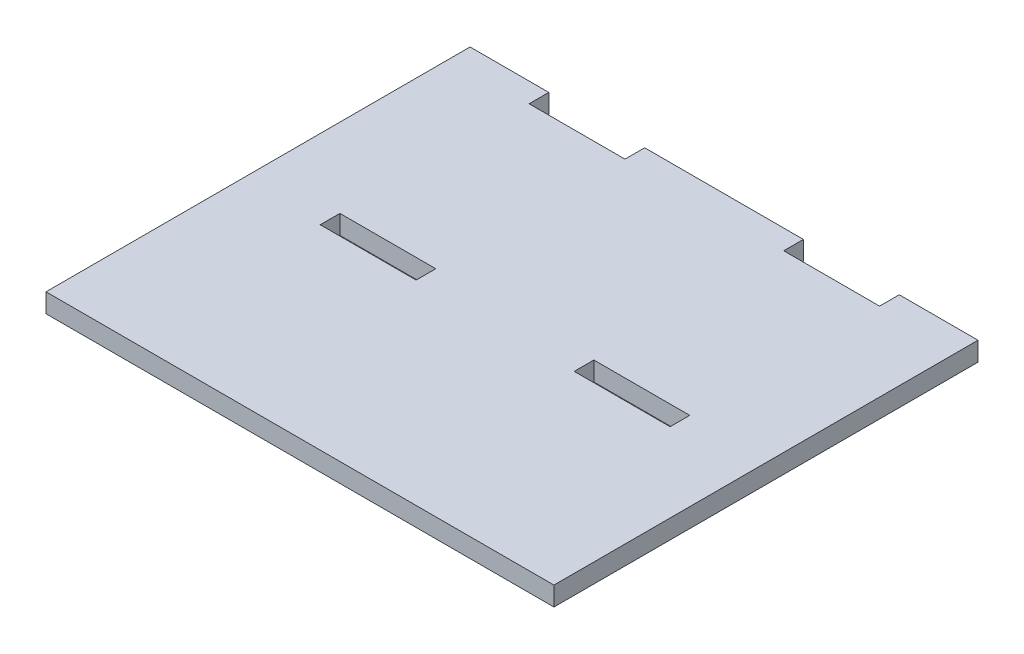
ISO-10303-21;
HEADER;
FILE_DESCRIPTION(('STEP AP214'),'2;1');
FILE_NAME('part.step','',(''),(''),'','','');
FILE_SCHEMA(('AUTOMOTIVE_DESIGN { 1 0 10303 214 1 1 1 1 }'));
ENDSEC;
DATA;
#1=APPLICATION_CONTEXT('core data for automotive mechanical design processes');
#2=APPLICATION_PROTOCOL_DEFINITION('international standard','automotive_design',2000,#1);
#3=PRODUCT_CONTEXT('',#1,'mechanical');
#4=PRODUCT('Part','Part','',(#3));
#5=PRODUCT_RELATED_PRODUCT_CATEGORY('part','',(#4));
#6=PRODUCT_DEFINITION_FORMATION('','',#4);
#7=PRODUCT_DEFINITION_CONTEXT('part definition',#1,'design');
#8=PRODUCT_DEFINITION('design','',#6,#7);
#9=PRODUCT_DEFINITION_SHAPE('','',#8);
#10=(LENGTH_UNIT() NAMED_UNIT(*) SI_UNIT(.MILLI.,.METRE.));
#11=(NAMED_UNIT(*) PLANE_ANGLE_UNIT() SI_UNIT($,.RADIAN.));
#12=(NAMED_UNIT(*) SI_UNIT($,.STERADIAN.) SOLID_ANGLE_UNIT());
#13=UNCERTAINTY_MEASURE_WITH_UNIT(LENGTH_MEASURE(1.E-05),#10,'distance_accuracy_value','');
#14=(GEOMETRIC_REPRESENTATION_CONTEXT(3) GLOBAL_UNCERTAINTY_ASSIGNED_CONTEXT((#13)) GLOBAL_UNIT_ASSIGNED_CONTEXT((#10,
#11,#12)) REPRESENTATION_CONTEXT('',''));
#15=CARTESIAN_POINT('',(0.,0.,0.));
#16=DIRECTION('',(0.,0.,1.));
#17=DIRECTION('',(1.,0.,0.));
#18=AXIS2_PLACEMENT_3D('',#15,#16,#17);
#19=CARTESIAN_POINT('',(0.,3.,0.));
#20=DIRECTION('',(0.,-1.,0.));
#21=DIRECTION('',(0.,0.,-1.));
#22=AXIS2_PLACEMENT_3D('',#19,#20,#21);
#23=PLANE('',#22);
#24=DIRECTION('',(0.,0.,1.));
#25=VECTOR('',#24,1.);
#26=CARTESIAN_POINT('',(12.45,3.,-33.84));
#27=LINE('',#26,#25);
#28=CARTESIAN_POINT('',(12.45,3.,-33.84));
#29=VERTEX_POINT('',#28);
#30=CARTESIAN_POINT('',(12.45,3.,-30.74));
#31=VERTEX_POINT('',#30);
#32=EDGE_CURVE('E212',#29,#31,#27,.T.);
#33=ORIENTED_EDGE('',*,*,#32,.F.);
#34=DIRECTION('',(-1.,0.,0.));
#35=VECTOR('',#34,1.);
#36=CARTESIAN_POINT('',(12.45,3.,-33.84));
#37=LINE('',#36,#35);
#38=CARTESIAN_POINT('',(27.55,3.,-33.84));
#39=VERTEX_POINT('',#38);
#40=EDGE_CURVE('E220',#39,#29,#37,.T.);
#41=ORIENTED_EDGE('',*,*,#40,.F.);
#42=DIRECTION('',(0.,0.,-1.));
#43=VECTOR('',#42,1.);
#44=CARTESIAN_POINT('',(27.55,3.,-33.84));
#45=LINE('',#44,#43);
#46=CARTESIAN_POINT('',(27.55,3.,-30.74));
#47=VERTEX_POINT('',#46);
#48=EDGE_CURVE('E217',#47,#39,#45,.T.);
#49=ORIENTED_EDGE('',*,*,#48,.F.);
#50=DIRECTION('',(1.,0.,0.));
#51=VECTOR('',#50,1.);
#52=CARTESIAN_POINT('',(12.45,3.,-30.74));
#53=LINE('',#52,#51);
#54=EDGE_CURVE('E214',#31,#47,#53,.T.);
#55=ORIENTED_EDGE('',*,*,#54,.F.);
#56=EDGE_LOOP('',(#33,#41,#49,#55));
#57=FACE_BOUND('',#56,.T.);
#58=DIRECTION('',(0.,0.,1.));
#59=VECTOR('',#58,1.);
#60=CARTESIAN_POINT('',(0.,3.,0.));
#61=LINE('',#60,#59);
#62=CARTESIAN_POINT('',(0.,3.,-66.79));
#63=VERTEX_POINT('',#62);
#64=CARTESIAN_POINT('',(0.,3.,0.));
#65=VERTEX_POINT('',#64);
#66=EDGE_CURVE('E243',#63,#65,#61,.T.);
#67=ORIENTED_EDGE('',*,*,#66,.T.);
#68=DIRECTION('',(1.,0.,0.));
#69=VECTOR('',#68,1.);
#70=CARTESIAN_POINT('',(0.,3.,0.));
#71=LINE('',#70,#69);
#72=CARTESIAN_POINT('',(80.,3.,0.));
#73=VERTEX_POINT('',#72);
#74=EDGE_CURVE('E246',#65,#73,#71,.T.);
#75=ORIENTED_EDGE('',*,*,#74,.T.);
#76=DIRECTION('',(0.,0.,-1.));
#77=VECTOR('',#76,1.);
#78=CARTESIAN_POINT('',(80.,3.,0.));
#79=LINE('',#78,#77);
#80=CARTESIAN_POINT('',(80.,3.,-66.79));
#81=VERTEX_POINT('',#80);
#82=EDGE_CURVE('E249',#73,#81,#79,.T.);
#83=ORIENTED_EDGE('',*,*,#82,.T.);
#84=DIRECTION('',(-1.,0.,0.));
#85=VECTOR('',#84,1.);
#86=CARTESIAN_POINT('',(67.6,3.,-66.79));
#87=LINE('',#86,#85);
#88=CARTESIAN_POINT('',(67.6,3.,-66.79));
#89=VERTEX_POINT('',#88);
#90=EDGE_CURVE('E251',#81,#89,#87,.T.);
#91=ORIENTED_EDGE('',*,*,#90,.T.);
#92=DIRECTION('',(0.,0.,1.));
#93=VECTOR('',#92,1.);
#94=CARTESIAN_POINT('',(67.6,3.,-66.79));
#95=LINE('',#94,#93);
#96=CARTESIAN_POINT('',(67.6,3.,-63.69));
#97=VERTEX_POINT('',#96);
#98=EDGE_CURVE('E253',#89,#97,#95,.T.);
#99=ORIENTED_EDGE('',*,*,#98,.T.);
#100=DIRECTION('',(-1.,0.,0.));
#101=VECTOR('',#100,1.);
#102=CARTESIAN_POINT('',(67.6,3.,-63.69));
#103=LINE('',#102,#101);
#104=CARTESIAN_POINT('',(52.5,3.,-63.69));
#105=VERTEX_POINT('',#104);
#106=EDGE_CURVE('E255',#97,#105,#103,.T.);
#107=ORIENTED_EDGE('',*,*,#106,.T.);
#108=DIRECTION('',(0.,0.,-1.));
#109=VECTOR('',#108,1.);
#110=CARTESIAN_POINT('',(52.5,3.,-66.79));
#111=LINE('',#110,#109);
#112=CARTESIAN_POINT('',(52.5,3.,-66.79));
#113=VERTEX_POINT('',#112);
#114=EDGE_CURVE('E257',#105,#113,#111,.T.);
#115=ORIENTED_EDGE('',*,*,#114,.T.);
#116=DIRECTION('',(-1.,0.,0.));
#117=VECTOR('',#116,1.);
#118=CARTESIAN_POINT('',(27.5,3.,-66.79));
#119=LINE('',#118,#117);
#120=CARTESIAN_POINT('',(27.5,3.,-66.79));
#121=VERTEX_POINT('',#120);
#122=EDGE_CURVE('E259',#113,#121,#119,.T.);
#123=ORIENTED_EDGE('',*,*,#122,.T.);
#124=DIRECTION('',(0.,0.,1.));
#125=VECTOR('',#124,1.);
#126=CARTESIAN_POINT('',(27.5,3.,-66.79));
#127=LINE('',#126,#125);
#128=CARTESIAN_POINT('',(27.5,3.,-63.69));
#129=VERTEX_POINT('',#128);
#130=EDGE_CURVE('E261',#121,#129,#127,.T.);
#131=ORIENTED_EDGE('',*,*,#130,.T.);
#132=DIRECTION('',(-1.,0.,0.));
#133=VECTOR('',#132,1.);
#134=CARTESIAN_POINT('',(12.4,3.,-63.69));
#135=LINE('',#134,#133);
#136=CARTESIAN_POINT('',(12.4,3.,-63.69));
#137=VERTEX_POINT('',#136);
#138=EDGE_CURVE('E263',#129,#137,#135,.T.);
#139=ORIENTED_EDGE('',*,*,#138,.T.);
#140=DIRECTION('',(0.,0.,-1.));
#141=VECTOR('',#140,1.);
#142=CARTESIAN_POINT('',(12.4,3.,-66.79));
#143=LINE('',#142,#141);
#144=CARTESIAN_POINT('',(12.4,3.,-66.79));
#145=VERTEX_POINT('',#144);
#146=EDGE_CURVE('E265',#137,#145,#143,.T.);
#147=ORIENTED_EDGE('',*,*,#146,.T.);
#148=DIRECTION('',(-1.,0.,0.));
#149=VECTOR('',#148,1.);
#150=CARTESIAN_POINT('',(0.,3.,-66.79));
#151=LINE('',#150,#149);
#152=EDGE_CURVE('E267',#145,#63,#151,.T.);
#153=ORIENTED_EDGE('',*,*,#152,.T.);
#154=EDGE_LOOP('',(#67,#75,#83,#91,#99,#107,#115,#123,#131,#139,#147,#153));
#155=FACE_BOUND('',#154,.T.);
#156=DIRECTION('',(0.,0.,-1.));
#157=VECTOR('',#156,1.);
#158=CARTESIAN_POINT('',(67.55,3.,-33.84));
#159=LINE('',#158,#157);
#160=CARTESIAN_POINT('',(67.55,3.,-30.74));
#161=VERTEX_POINT('',#160);
#162=CARTESIAN_POINT('',(67.55,3.,-33.84));
#163=VERTEX_POINT('',#162);
#164=EDGE_CURVE('E176',#161,#163,#159,.T.);
#165=ORIENTED_EDGE('',*,*,#164,.F.);
#166=DIRECTION('',(1.,0.,0.));
#167=VECTOR('',#166,1.);
#168=CARTESIAN_POINT('',(67.55,3.,-30.74));
#169=LINE('',#168,#167);
#170=CARTESIAN_POINT('',(52.45,3.,-30.74));
#171=VERTEX_POINT('',#170);
#172=EDGE_CURVE('E198',#171,#161,#169,.T.);
#173=ORIENTED_EDGE('',*,*,#172,.F.);
#174=DIRECTION('',(0.,0.,1.));
#175=VECTOR('',#174,1.);
#176=CARTESIAN_POINT('',(52.45,3.,-33.84));
#177=LINE('',#176,#175);
#178=CARTESIAN_POINT('',(52.45,3.,-33.84));
#179=VERTEX_POINT('',#178);
#180=EDGE_CURVE('E196',#179,#171,#177,.T.);
#181=ORIENTED_EDGE('',*,*,#180,.F.);
#182=DIRECTION('',(-1.,0.,0.));
#183=VECTOR('',#182,1.);
#184=CARTESIAN_POINT('',(67.55,3.,-33.84));
#185=LINE('',#184,#183);
#186=EDGE_CURVE('E184',#163,#179,#185,.T.);
#187=ORIENTED_EDGE('',*,*,#186,.F.);
#188=EDGE_LOOP('',(#165,#173,#181,#187));
#189=FACE_BOUND('',#188,.T.);
#190=ADVANCED_FACE('F39',(#57,#155,#189),#23,.F.);
#191=CARTESIAN_POINT('',(0.,0.,0.));
#192=DIRECTION('',(0.,-1.,0.));
#193=DIRECTION('',(0.,0.,-1.));
#194=AXIS2_PLACEMENT_3D('',#191,#192,#193);
#195=PLANE('',#194);
#196=DIRECTION('',(0.,0.,1.));
#197=VECTOR('',#196,1.);
#198=CARTESIAN_POINT('',(0.,0.,0.));
#199=LINE('',#198,#197);
#200=CARTESIAN_POINT('',(0.,0.,-66.79));
#201=VERTEX_POINT('',#200);
#202=CARTESIAN_POINT('',(0.,0.,0.));
#203=VERTEX_POINT('',#202);
#204=EDGE_CURVE('E242',#201,#203,#199,.T.);
#205=ORIENTED_EDGE('',*,*,#204,.F.);
#206=DIRECTION('',(-1.,0.,0.));
#207=VECTOR('',#206,1.);
#208=CARTESIAN_POINT('',(0.,0.,-66.79));
#209=LINE('',#208,#207);
#210=CARTESIAN_POINT('',(12.4,0.,-66.79));
#211=VERTEX_POINT('',#210);
#212=EDGE_CURVE('E247',#211,#201,#209,.T.);
#213=ORIENTED_EDGE('',*,*,#212,.F.);
#214=DIRECTION('',(0.,0.,-1.));
#215=VECTOR('',#214,1.);
#216=CARTESIAN_POINT('',(12.4,0.,-66.79));
#217=LINE('',#216,#215);
#218=CARTESIAN_POINT('',(12.4,0.,-63.69));
#219=VERTEX_POINT('',#218);
#220=EDGE_CURVE('E290',#219,#211,#217,.T.);
#221=ORIENTED_EDGE('',*,*,#220,.F.);
#222=DIRECTION('',(-1.,0.,0.));
#223=VECTOR('',#222,1.);
#224=CARTESIAN_POINT('',(12.4,0.,-63.69));
#225=LINE('',#224,#223);
#226=CARTESIAN_POINT('',(27.5,0.,-63.69));
#227=VERTEX_POINT('',#226);
#228=EDGE_CURVE('E288',#227,#219,#225,.T.);
#229=ORIENTED_EDGE('',*,*,#228,.F.);
#230=DIRECTION('',(0.,0.,1.));
#231=VECTOR('',#230,1.);
#232=CARTESIAN_POINT('',(27.5,0.,-66.79));
#233=LINE('',#232,#231);
#234=CARTESIAN_POINT('',(27.5,0.,-66.79));
#235=VERTEX_POINT('',#234);
#236=EDGE_CURVE('E286',#235,#227,#233,.T.);
#237=ORIENTED_EDGE('',*,*,#236,.F.);
#238=DIRECTION('',(-1.,0.,0.));
#239=VECTOR('',#238,1.);
#240=CARTESIAN_POINT('',(27.5,0.,-66.79));
#241=LINE('',#240,#239);
#242=CARTESIAN_POINT('',(52.5,0.,-66.79));
#243=VERTEX_POINT('',#242);
#244=EDGE_CURVE('E284',#243,#235,#241,.T.);
#245=ORIENTED_EDGE('',*,*,#244,.F.);
#246=DIRECTION('',(0.,0.,-1.));
#247=VECTOR('',#246,1.);
#248=CARTESIAN_POINT('',(52.5,0.,-66.79));
#249=LINE('',#248,#247);
#250=CARTESIAN_POINT('',(52.5,0.,-63.69));
#251=VERTEX_POINT('',#250);
#252=EDGE_CURVE('E282',#251,#243,#249,.T.);
#253=ORIENTED_EDGE('',*,*,#252,.F.);
#254=DIRECTION('',(-1.,0.,0.));
#255=VECTOR('',#254,1.);
#256=CARTESIAN_POINT('',(67.6,0.,-63.69));
#257=LINE('',#256,#255);
#258=CARTESIAN_POINT('',(67.6,0.,-63.69));
#259=VERTEX_POINT('',#258);
#260=EDGE_CURVE('E280',#259,#251,#257,.T.);
#261=ORIENTED_EDGE('',*,*,#260,.F.);
#262=DIRECTION('',(0.,0.,1.));
#263=VECTOR('',#262,1.);
#264=CARTESIAN_POINT('',(67.6,0.,-66.79));
#265=LINE('',#264,#263);
#266=CARTESIAN_POINT('',(67.6,0.,-66.79));
#267=VERTEX_POINT('',#266);
#268=EDGE_CURVE('E278',#267,#259,#265,.T.);
#269=ORIENTED_EDGE('',*,*,#268,.F.);
#270=DIRECTION('',(-1.,0.,0.));
#271=VECTOR('',#270,1.);
#272=CARTESIAN_POINT('',(67.6,0.,-66.79));
#273=LINE('',#272,#271);
#274=CARTESIAN_POINT('',(80.,0.,-66.79));
#275=VERTEX_POINT('',#274);
#276=EDGE_CURVE('E276',#275,#267,#273,.T.);
#277=ORIENTED_EDGE('',*,*,#276,.F.);
#278=DIRECTION('',(0.,0.,-1.));
#279=VECTOR('',#278,1.);
#280=CARTESIAN_POINT('',(80.,0.,0.));
#281=LINE('',#280,#279);
#282=CARTESIAN_POINT('',(80.,0.,0.));
#283=VERTEX_POINT('',#282);
#284=EDGE_CURVE('E274',#283,#275,#281,.T.);
#285=ORIENTED_EDGE('',*,*,#284,.F.);
#286=DIRECTION('',(1.,0.,0.));
#287=VECTOR('',#286,1.);
#288=CARTESIAN_POINT('',(0.,0.,0.));
#289=LINE('',#288,#287);
#290=EDGE_CURVE('E272',#203,#283,#289,.T.);
#291=ORIENTED_EDGE('',*,*,#290,.F.);
#292=EDGE_LOOP('',(#205,#213,#221,#229,#237,#245,#253,#261,#269,#277,#285,#291));
#293=FACE_BOUND('',#292,.T.);
#294=DIRECTION('',(-1.,0.,0.));
#295=VECTOR('',#294,1.);
#296=CARTESIAN_POINT('',(12.45,0.,-33.84));
#297=LINE('',#296,#295);
#298=CARTESIAN_POINT('',(27.55,0.,-33.84));
#299=VERTEX_POINT('',#298);
#300=CARTESIAN_POINT('',(12.45,0.,-33.84));
#301=VERTEX_POINT('',#300);
#302=EDGE_CURVE('E215',#299,#301,#297,.T.);
#303=ORIENTED_EDGE('',*,*,#302,.T.);
#304=DIRECTION('',(0.,0.,1.));
#305=VECTOR('',#304,1.);
#306=CARTESIAN_POINT('',(12.45,0.,-33.84));
#307=LINE('',#306,#305);
#308=CARTESIAN_POINT('',(12.45,0.,-30.74));
#309=VERTEX_POINT('',#308);
#310=EDGE_CURVE('E192',#301,#309,#307,.T.);
#311=ORIENTED_EDGE('',*,*,#310,.T.);
#312=DIRECTION('',(1.,0.,0.));
#313=VECTOR('',#312,1.);
#314=CARTESIAN_POINT('',(12.45,0.,-30.74));
#315=LINE('',#314,#313);
#316=CARTESIAN_POINT('',(27.55,0.,-30.74));
#317=VERTEX_POINT('',#316);
#318=EDGE_CURVE('E225',#309,#317,#315,.T.);
#319=ORIENTED_EDGE('',*,*,#318,.T.);
#320=DIRECTION('',(0.,0.,-1.));
#321=VECTOR('',#320,1.);
#322=CARTESIAN_POINT('',(27.55,0.,-33.84));
#323=LINE('',#322,#321);
#324=EDGE_CURVE('E228',#317,#299,#323,.T.);
#325=ORIENTED_EDGE('',*,*,#324,.T.);
#326=EDGE_LOOP('',(#303,#311,#319,#325));
#327=FACE_BOUND('',#326,.T.);
#328=DIRECTION('',(1.,0.,0.));
#329=VECTOR('',#328,1.);
#330=CARTESIAN_POINT('',(67.55,0.,-30.74));
#331=LINE('',#330,#329);
#332=CARTESIAN_POINT('',(52.45,0.,-30.74));
#333=VERTEX_POINT('',#332);
#334=CARTESIAN_POINT('',(67.55,0.,-30.74));
#335=VERTEX_POINT('',#334);
#336=EDGE_CURVE('E185',#333,#335,#331,.T.);
#337=ORIENTED_EDGE('',*,*,#336,.T.);
#338=DIRECTION('',(0.,0.,-1.));
#339=VECTOR('',#338,1.);
#340=CARTESIAN_POINT('',(67.55,0.,-33.84));
#341=LINE('',#340,#339);
#342=CARTESIAN_POINT('',(67.55,0.,-33.84));
#343=VERTEX_POINT('',#342);
#344=EDGE_CURVE('E62',#335,#343,#341,.T.);
#345=ORIENTED_EDGE('',*,*,#344,.T.);
#346=DIRECTION('',(-1.,0.,0.));
#347=VECTOR('',#346,1.);
#348=CARTESIAN_POINT('',(67.55,0.,-33.84));
#349=LINE('',#348,#347);
#350=CARTESIAN_POINT('',(52.45,0.,-33.84));
#351=VERTEX_POINT('',#350);
#352=EDGE_CURVE('E191',#343,#351,#349,.T.);
#353=ORIENTED_EDGE('',*,*,#352,.T.);
#354=DIRECTION('',(0.,0.,1.));
#355=VECTOR('',#354,1.);
#356=CARTESIAN_POINT('',(52.45,0.,-33.84));
#357=LINE('',#356,#355);
#358=EDGE_CURVE('E204',#351,#333,#357,.T.);
#359=ORIENTED_EDGE('',*,*,#358,.T.);
#360=EDGE_LOOP('',(#337,#345,#353,#359));
#361=FACE_BOUND('',#360,.T.);
#362=ADVANCED_FACE('F332',(#293,#327,#361),#195,.T.);
#363=CARTESIAN_POINT('',(0.,3.,0.));
#364=DIRECTION('',(1.,0.,0.));
#365=DIRECTION('',(0.,0.,-1.));
#366=AXIS2_PLACEMENT_3D('',#363,#364,#365);
#367=PLANE('',#366);
#368=ORIENTED_EDGE('',*,*,#204,.T.);
#369=DIRECTION('',(0.,-1.,0.));
#370=VECTOR('',#369,1.);
#371=CARTESIAN_POINT('',(0.,3.,0.));
#372=LINE('',#371,#370);
#373=EDGE_CURVE('E11',#65,#203,#372,.T.);
#374=ORIENTED_EDGE('',*,*,#373,.F.);
#375=ORIENTED_EDGE('',*,*,#66,.F.);
#376=DIRECTION('',(0.,-1.,0.));
#377=VECTOR('',#376,1.);
#378=CARTESIAN_POINT('',(0.,3.,-66.79));
#379=LINE('',#378,#377);
#380=EDGE_CURVE('E269',#63,#201,#379,.T.);
#381=ORIENTED_EDGE('',*,*,#380,.T.);
#382=EDGE_LOOP('',(#368,#374,#375,#381));
#383=FACE_BOUND('',#382,.T.);
#384=ADVANCED_FACE('F41',(#383),#367,.F.);
#385=CARTESIAN_POINT('',(0.,3.,0.));
#386=DIRECTION('',(0.,0.,-1.));
#387=DIRECTION('',(-1.,0.,0.));
#388=AXIS2_PLACEMENT_3D('',#385,#386,#387);
#389=PLANE('',#388);
#390=ORIENTED_EDGE('',*,*,#290,.T.);
#391=DIRECTION('',(0.,-1.,0.));
#392=VECTOR('',#391,1.);
#393=CARTESIAN_POINT('',(80.,3.,0.));
#394=LINE('',#393,#392);
#395=EDGE_CURVE('E47',#73,#283,#394,.T.);
#396=ORIENTED_EDGE('',*,*,#395,.F.);
#397=ORIENTED_EDGE('',*,*,#74,.F.);
#398=ORIENTED_EDGE('',*,*,#373,.T.);
#399=EDGE_LOOP('',(#390,#396,#397,#398));
#400=FACE_BOUND('',#399,.T.);
#401=ADVANCED_FACE('F349',(#400),#389,.F.);
#402=CARTESIAN_POINT('',(80.,3.,0.));
#403=DIRECTION('',(-1.,0.,0.));
#404=DIRECTION('',(0.,0.,1.));
#405=AXIS2_PLACEMENT_3D('',#402,#403,#404);
#406=PLANE('',#405);
#407=ORIENTED_EDGE('',*,*,#284,.T.);
#408=DIRECTION('',(0.,-1.,0.));
#409=VECTOR('',#408,1.);
#410=CARTESIAN_POINT('',(80.,3.,-66.79));
#411=LINE('',#410,#409);
#412=EDGE_CURVE('E319',#81,#275,#411,.T.);
#413=ORIENTED_EDGE('',*,*,#412,.F.);
#414=ORIENTED_EDGE('',*,*,#82,.F.);
#415=ORIENTED_EDGE('',*,*,#395,.T.);
#416=EDGE_LOOP('',(#407,#413,#414,#415));
#417=FACE_BOUND('',#416,.T.);
#418=ADVANCED_FACE('F326',(#417),#406,.F.);
#419=CARTESIAN_POINT('',(67.6,3.,-66.79));
#420=DIRECTION('',(0.,0.,1.));
#421=DIRECTION('',(1.,0.,0.));
#422=AXIS2_PLACEMENT_3D('',#419,#420,#421);
#423=PLANE('',#422);
#424=ORIENTED_EDGE('',*,*,#276,.T.);
#425=DIRECTION('',(0.,-1.,0.));
#426=VECTOR('',#425,1.);
#427=CARTESIAN_POINT('',(67.6,3.,-66.79));
#428=LINE('',#427,#426);
#429=EDGE_CURVE('E316',#89,#267,#428,.T.);
#430=ORIENTED_EDGE('',*,*,#429,.F.);
#431=ORIENTED_EDGE('',*,*,#90,.F.);
#432=ORIENTED_EDGE('',*,*,#412,.T.);
#433=EDGE_LOOP('',(#424,#430,#431,#432));
#434=FACE_BOUND('',#433,.T.);
#435=ADVANCED_FACE('F338',(#434),#423,.F.);
#436=CARTESIAN_POINT('',(67.6,3.,-66.79));
#437=DIRECTION('',(1.,0.,0.));
#438=DIRECTION('',(0.,0.,-1.));
#439=AXIS2_PLACEMENT_3D('',#436,#437,#438);
#440=PLANE('',#439);
#441=ORIENTED_EDGE('',*,*,#268,.T.);
#442=DIRECTION('',(0.,-1.,0.));
#443=VECTOR('',#442,1.);
#444=CARTESIAN_POINT('',(67.6,3.,-63.69));
#445=LINE('',#444,#443);
#446=EDGE_CURVE('E313',#97,#259,#445,.T.);
#447=ORIENTED_EDGE('',*,*,#446,.F.);
#448=ORIENTED_EDGE('',*,*,#98,.F.);
#449=ORIENTED_EDGE('',*,*,#429,.T.);
#450=EDGE_LOOP('',(#441,#447,#448,#449));
#451=FACE_BOUND('',#450,.T.);
#452=ADVANCED_FACE('F342',(#451),#440,.F.);
#453=CARTESIAN_POINT('',(67.6,3.,-63.69));
#454=DIRECTION('',(0.,0.,1.));
#455=DIRECTION('',(1.,0.,0.));
#456=AXIS2_PLACEMENT_3D('',#453,#454,#455);
#457=PLANE('',#456);
#458=ORIENTED_EDGE('',*,*,#260,.T.);
#459=DIRECTION('',(0.,-1.,0.));
#460=VECTOR('',#459,1.);
#461=CARTESIAN_POINT('',(52.5,3.,-63.69));
#462=LINE('',#461,#460);
#463=EDGE_CURVE('E310',#105,#251,#462,.T.);
#464=ORIENTED_EDGE('',*,*,#463,.F.);
#465=ORIENTED_EDGE('',*,*,#106,.F.);
#466=ORIENTED_EDGE('',*,*,#446,.T.);
#467=EDGE_LOOP('',(#458,#464,#465,#466));
#468=FACE_BOUND('',#467,.T.);
#469=ADVANCED_FACE('F382',(#468),#457,.F.);
#470=CARTESIAN_POINT('',(52.5,3.,-66.79));
#471=DIRECTION('',(-1.,0.,0.));
#472=DIRECTION('',(0.,0.,1.));
#473=AXIS2_PLACEMENT_3D('',#470,#471,#472);
#474=PLANE('',#473);
#475=ORIENTED_EDGE('',*,*,#252,.T.);
#476=DIRECTION('',(0.,-1.,0.));
#477=VECTOR('',#476,1.);
#478=CARTESIAN_POINT('',(52.5,3.,-66.79));
#479=LINE('',#478,#477);
#480=EDGE_CURVE('E307',#113,#243,#479,.T.);
#481=ORIENTED_EDGE('',*,*,#480,.F.);
#482=ORIENTED_EDGE('',*,*,#114,.F.);
#483=ORIENTED_EDGE('',*,*,#463,.T.);
#484=EDGE_LOOP('',(#475,#481,#482,#483));
#485=FACE_BOUND('',#484,.T.);
#486=ADVANCED_FACE('F380',(#485),#474,.F.);
#487=CARTESIAN_POINT('',(27.5,3.,-66.79));
#488=DIRECTION('',(0.,0.,1.));
#489=DIRECTION('',(1.,0.,0.));
#490=AXIS2_PLACEMENT_3D('',#487,#488,#489);
#491=PLANE('',#490);
#492=ORIENTED_EDGE('',*,*,#244,.T.);
#493=DIRECTION('',(0.,-1.,0.));
#494=VECTOR('',#493,1.);
#495=CARTESIAN_POINT('',(27.5,3.,-66.79));
#496=LINE('',#495,#494);
#497=EDGE_CURVE('E304',#121,#235,#496,.T.);
#498=ORIENTED_EDGE('',*,*,#497,.F.);
#499=ORIENTED_EDGE('',*,*,#122,.F.);
#500=ORIENTED_EDGE('',*,*,#480,.T.);
#501=EDGE_LOOP('',(#492,#498,#499,#500));
#502=FACE_BOUND('',#501,.T.);
#503=ADVANCED_FACE('F376',(#502),#491,.F.);
#504=CARTESIAN_POINT('',(27.5,3.,-66.79));
#505=DIRECTION('',(1.,0.,0.));
#506=DIRECTION('',(0.,0.,-1.));
#507=AXIS2_PLACEMENT_3D('',#504,#505,#506);
#508=PLANE('',#507);
#509=ORIENTED_EDGE('',*,*,#236,.T.);
#510=DIRECTION('',(0.,-1.,0.));
#511=VECTOR('',#510,1.);
#512=CARTESIAN_POINT('',(27.5,3.,-63.69));
#513=LINE('',#512,#511);
#514=EDGE_CURVE('E301',#129,#227,#513,.T.);
#515=ORIENTED_EDGE('',*,*,#514,.F.);
#516=ORIENTED_EDGE('',*,*,#130,.F.);
#517=ORIENTED_EDGE('',*,*,#497,.T.);
#518=EDGE_LOOP('',(#509,#515,#516,#517));
#519=FACE_BOUND('',#518,.T.);
#520=ADVANCED_FACE('F371',(#519),#508,.F.);
#521=CARTESIAN_POINT('',(12.4,3.,-63.69));
#522=DIRECTION('',(0.,0.,1.));
#523=DIRECTION('',(1.,0.,0.));
#524=AXIS2_PLACEMENT_3D('',#521,#522,#523);
#525=PLANE('',#524);
#526=ORIENTED_EDGE('',*,*,#228,.T.);
#527=DIRECTION('',(0.,-1.,0.));
#528=VECTOR('',#527,1.);
#529=CARTESIAN_POINT('',(12.4,3.,-63.69));
#530=LINE('',#529,#528);
#531=EDGE_CURVE('E298',#137,#219,#530,.T.);
#532=ORIENTED_EDGE('',*,*,#531,.F.);
#533=ORIENTED_EDGE('',*,*,#138,.F.);
#534=ORIENTED_EDGE('',*,*,#514,.T.);
#535=EDGE_LOOP('',(#526,#532,#533,#534));
#536=FACE_BOUND('',#535,.T.);
#537=ADVANCED_FACE('F365',(#536),#525,.F.);
#538=CARTESIAN_POINT('',(12.4,3.,-66.79));
#539=DIRECTION('',(-1.,0.,0.));
#540=DIRECTION('',(0.,0.,1.));
#541=AXIS2_PLACEMENT_3D('',#538,#539,#540);
#542=PLANE('',#541);
#543=ORIENTED_EDGE('',*,*,#220,.T.);
#544=DIRECTION('',(0.,-1.,0.));
#545=VECTOR('',#544,1.);
#546=CARTESIAN_POINT('',(12.4,3.,-66.79));
#547=LINE('',#546,#545);
#548=EDGE_CURVE('E295',#145,#211,#547,.T.);
#549=ORIENTED_EDGE('',*,*,#548,.F.);
#550=ORIENTED_EDGE('',*,*,#146,.F.);
#551=ORIENTED_EDGE('',*,*,#531,.T.);
#552=EDGE_LOOP('',(#543,#549,#550,#551));
#553=FACE_BOUND('',#552,.T.);
#554=ADVANCED_FACE('F361',(#553),#542,.F.);
#555=CARTESIAN_POINT('',(0.,3.,-66.79));
#556=DIRECTION('',(0.,0.,1.));
#557=DIRECTION('',(1.,0.,0.));
#558=AXIS2_PLACEMENT_3D('',#555,#556,#557);
#559=PLANE('',#558);
#560=ORIENTED_EDGE('',*,*,#212,.T.);
#561=ORIENTED_EDGE('',*,*,#380,.F.);
#562=ORIENTED_EDGE('',*,*,#152,.F.);
#563=ORIENTED_EDGE('',*,*,#548,.T.);
#564=EDGE_LOOP('',(#560,#561,#562,#563));
#565=FACE_BOUND('',#564,.T.);
#566=ADVANCED_FACE('F356',(#565),#559,.F.);
#567=CARTESIAN_POINT('',(12.45,3.,-33.84));
#568=DIRECTION('',(1.,0.,0.));
#569=DIRECTION('',(0.,0.,-1.));
#570=AXIS2_PLACEMENT_3D('',#567,#568,#569);
#571=PLANE('',#570);
#572=ORIENTED_EDGE('',*,*,#310,.F.);
#573=DIRECTION('',(0.,-1.,0.));
#574=VECTOR('',#573,1.);
#575=CARTESIAN_POINT('',(12.45,3.,-33.84));
#576=LINE('',#575,#574);
#577=EDGE_CURVE('E222',#29,#301,#576,.T.);
#578=ORIENTED_EDGE('',*,*,#577,.F.);
#579=ORIENTED_EDGE('',*,*,#32,.T.);
#580=DIRECTION('',(0.,-1.,0.));
#581=VECTOR('',#580,1.);
#582=CARTESIAN_POINT('',(12.45,3.,-30.74));
#583=LINE('',#582,#581);
#584=EDGE_CURVE('E239',#31,#309,#583,.T.);
#585=ORIENTED_EDGE('',*,*,#584,.T.);
#586=EDGE_LOOP('',(#572,#578,#579,#585));
#587=FACE_BOUND('',#586,.T.);
#588=ADVANCED_FACE('F400',(#587),#571,.T.);
#589=CARTESIAN_POINT('',(12.45,3.,-30.74));
#590=DIRECTION('',(0.,0.,-1.));
#591=DIRECTION('',(-1.,0.,0.));
#592=AXIS2_PLACEMENT_3D('',#589,#590,#591);
#593=PLANE('',#592);
#594=ORIENTED_EDGE('',*,*,#318,.F.);
#595=ORIENTED_EDGE('',*,*,#584,.F.);
#596=ORIENTED_EDGE('',*,*,#54,.T.);
#597=DIRECTION('',(0.,-1.,0.));
#598=VECTOR('',#597,1.);
#599=CARTESIAN_POINT('',(27.55,3.,-30.74));
#600=LINE('',#599,#598);
#601=EDGE_CURVE('E237',#47,#317,#600,.T.);
#602=ORIENTED_EDGE('',*,*,#601,.T.);
#603=EDGE_LOOP('',(#594,#595,#596,#602));
#604=FACE_BOUND('',#603,.T.);
#605=ADVANCED_FACE('F443',(#604),#593,.T.);
#606=CARTESIAN_POINT('',(27.55,3.,-33.84));
#607=DIRECTION('',(-1.,0.,0.));
#608=DIRECTION('',(0.,0.,1.));
#609=AXIS2_PLACEMENT_3D('',#606,#607,#608);
#610=PLANE('',#609);
#611=ORIENTED_EDGE('',*,*,#324,.F.);
#612=ORIENTED_EDGE('',*,*,#601,.F.);
#613=ORIENTED_EDGE('',*,*,#48,.T.);
#614=DIRECTION('',(0.,-1.,0.));
#615=VECTOR('',#614,1.);
#616=CARTESIAN_POINT('',(27.55,3.,-33.84));
#617=LINE('',#616,#615);
#618=EDGE_CURVE('E235',#39,#299,#617,.T.);
#619=ORIENTED_EDGE('',*,*,#618,.T.);
#620=EDGE_LOOP('',(#611,#612,#613,#619));
#621=FACE_BOUND('',#620,.T.);
#622=ADVANCED_FACE('F451',(#621),#610,.T.);
#623=CARTESIAN_POINT('',(12.45,3.,-33.84));
#624=DIRECTION('',(0.,0.,1.));
#625=DIRECTION('',(1.,0.,0.));
#626=AXIS2_PLACEMENT_3D('',#623,#624,#625);
#627=PLANE('',#626);
#628=ORIENTED_EDGE('',*,*,#302,.F.);
#629=ORIENTED_EDGE('',*,*,#618,.F.);
#630=ORIENTED_EDGE('',*,*,#40,.T.);
#631=ORIENTED_EDGE('',*,*,#577,.T.);
#632=EDGE_LOOP('',(#628,#629,#630,#631));
#633=FACE_BOUND('',#632,.T.);
#634=ADVANCED_FACE('F459',(#633),#627,.T.);
#635=CARTESIAN_POINT('',(67.55,3.,-33.84));
#636=DIRECTION('',(-1.,0.,0.));
#637=DIRECTION('',(0.,0.,1.));
#638=AXIS2_PLACEMENT_3D('',#635,#636,#637);
#639=PLANE('',#638);
#640=ORIENTED_EDGE('',*,*,#344,.F.);
#641=DIRECTION('',(0.,-1.,0.));
#642=VECTOR('',#641,1.);
#643=CARTESIAN_POINT('',(67.55,3.,-30.74));
#644=LINE('',#643,#642);
#645=EDGE_CURVE('E180',#161,#335,#644,.T.);
#646=ORIENTED_EDGE('',*,*,#645,.F.);
#647=ORIENTED_EDGE('',*,*,#164,.T.);
#648=DIRECTION('',(0.,-1.,0.));
#649=VECTOR('',#648,1.);
#650=CARTESIAN_POINT('',(67.55,3.,-33.84));
#651=LINE('',#650,#649);
#652=EDGE_CURVE('E179',#163,#343,#651,.T.);
#653=ORIENTED_EDGE('',*,*,#652,.T.);
#654=EDGE_LOOP('',(#640,#646,#647,#653));
#655=FACE_BOUND('',#654,.T.);
#656=ADVANCED_FACE('F178',(#655),#639,.T.);
#657=CARTESIAN_POINT('',(67.55,3.,-33.84));
#658=DIRECTION('',(0.,0.,1.));
#659=DIRECTION('',(1.,0.,0.));
#660=AXIS2_PLACEMENT_3D('',#657,#658,#659);
#661=PLANE('',#660);
#662=ORIENTED_EDGE('',*,*,#352,.F.);
#663=ORIENTED_EDGE('',*,*,#652,.F.);
#664=ORIENTED_EDGE('',*,*,#186,.T.);
#665=DIRECTION('',(0.,-1.,0.));
#666=VECTOR('',#665,1.);
#667=CARTESIAN_POINT('',(52.45,3.,-33.84));
#668=LINE('',#667,#666);
#669=EDGE_CURVE('E193',#179,#351,#668,.T.);
#670=ORIENTED_EDGE('',*,*,#669,.T.);
#671=EDGE_LOOP('',(#662,#663,#664,#670));
#672=FACE_BOUND('',#671,.T.);
#673=ADVANCED_FACE('F188',(#672),#661,.T.);
#674=CARTESIAN_POINT('',(52.45,3.,-33.84));
#675=DIRECTION('',(1.,0.,0.));
#676=DIRECTION('',(0.,0.,-1.));
#677=AXIS2_PLACEMENT_3D('',#674,#675,#676);
#678=PLANE('',#677);
#679=ORIENTED_EDGE('',*,*,#358,.F.);
#680=ORIENTED_EDGE('',*,*,#669,.F.);
#681=ORIENTED_EDGE('',*,*,#180,.T.);
#682=DIRECTION('',(0.,-1.,0.));
#683=VECTOR('',#682,1.);
#684=CARTESIAN_POINT('',(52.45,3.,-30.74));
#685=LINE('',#684,#683);
#686=EDGE_CURVE('E54',#171,#333,#685,.T.);
#687=ORIENTED_EDGE('',*,*,#686,.T.);
#688=EDGE_LOOP('',(#679,#680,#681,#687));
#689=FACE_BOUND('',#688,.T.);
#690=ADVANCED_FACE('F483',(#689),#678,.T.);
#691=CARTESIAN_POINT('',(67.55,3.,-30.74));
#692=DIRECTION('',(0.,0.,-1.));
#693=DIRECTION('',(-1.,0.,0.));
#694=AXIS2_PLACEMENT_3D('',#691,#692,#693);
#695=PLANE('',#694);
#696=ORIENTED_EDGE('',*,*,#336,.F.);
#697=ORIENTED_EDGE('',*,*,#686,.F.);
#698=ORIENTED_EDGE('',*,*,#172,.T.);
#699=ORIENTED_EDGE('',*,*,#645,.T.);
#700=EDGE_LOOP('',(#696,#697,#698,#699));
#701=FACE_BOUND('',#700,.T.);
#702=ADVANCED_FACE('F491',(#701),#695,.T.);
#703=CLOSED_SHELL('',(#190,#362,#384,#401,#418,#435,#452,#469,#486,#503,#520,#537,#554,#566,
#588,#605,#622,#634,#656,#673,#690,#702));
#704=MANIFOLD_SOLID_BREP('B2',#703);
#705=ADVANCED_BREP_SHAPE_REPRESENTATION('',(#18,#704),#14);
#706=SHAPE_DEFINITION_REPRESENTATION(#9,#705);
ENDSEC;
END-ISO-10303-21;
